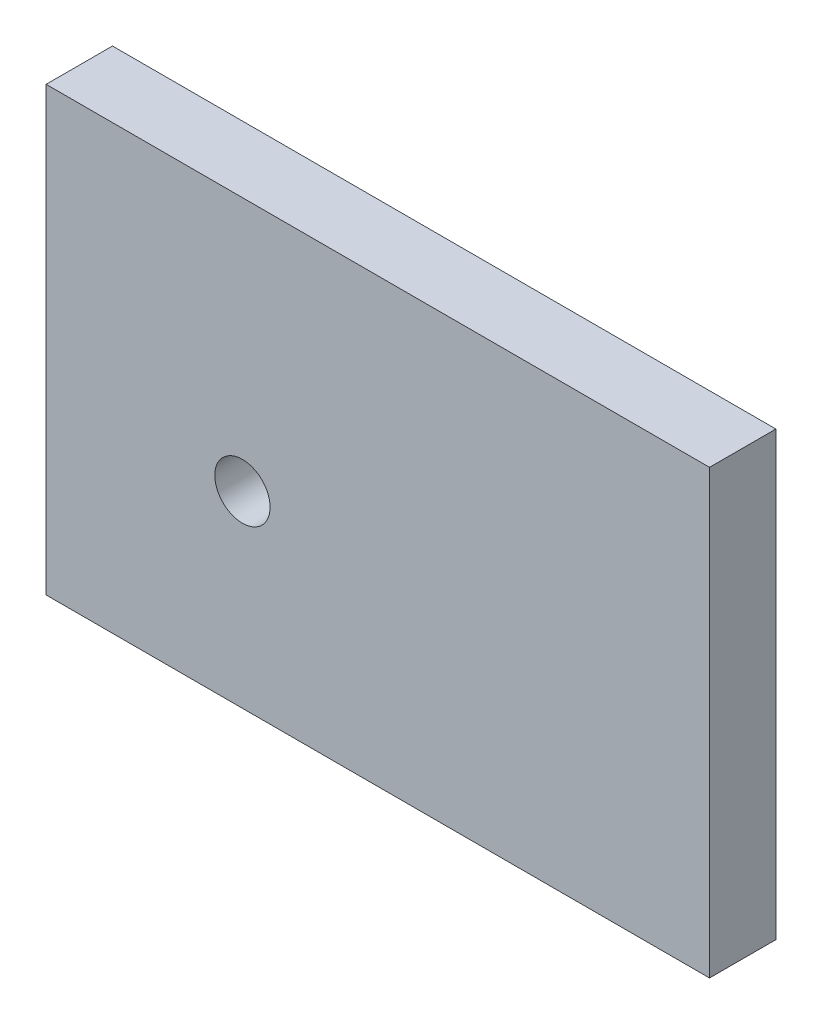
ISO-10303-21;
HEADER;
FILE_DESCRIPTION(('STEP AP214'),'2;1');
FILE_NAME('part.step','',(''),(''),'','','');
FILE_SCHEMA(('AUTOMOTIVE_DESIGN { 1 0 10303 214 1 1 1 1 }'));
ENDSEC;
DATA;
#1=APPLICATION_CONTEXT('core data for automotive mechanical design processes');
#2=APPLICATION_PROTOCOL_DEFINITION('international standard','automotive_design',2000,#1);
#3=PRODUCT_CONTEXT('',#1,'mechanical');
#4=PRODUCT('Part','Part','',(#3));
#5=PRODUCT_RELATED_PRODUCT_CATEGORY('part','',(#4));
#6=PRODUCT_DEFINITION_FORMATION('','',#4);
#7=PRODUCT_DEFINITION_CONTEXT('part definition',#1,'design');
#8=PRODUCT_DEFINITION('design','',#6,#7);
#9=PRODUCT_DEFINITION_SHAPE('','',#8);
#10=(LENGTH_UNIT() NAMED_UNIT(*) SI_UNIT(.MILLI.,.METRE.));
#11=(NAMED_UNIT(*) PLANE_ANGLE_UNIT() SI_UNIT($,.RADIAN.));
#12=(NAMED_UNIT(*) SI_UNIT($,.STERADIAN.) SOLID_ANGLE_UNIT());
#13=UNCERTAINTY_MEASURE_WITH_UNIT(LENGTH_MEASURE(1.E-05),#10,'distance_accuracy_value','');
#14=(GEOMETRIC_REPRESENTATION_CONTEXT(3) GLOBAL_UNCERTAINTY_ASSIGNED_CONTEXT((#13)) GLOBAL_UNIT_ASSIGNED_CONTEXT((#10,
#11,#12)) REPRESENTATION_CONTEXT('',''));
#15=CARTESIAN_POINT('',(0.,0.,0.));
#16=DIRECTION('',(0.,0.,1.));
#17=DIRECTION('',(1.,0.,0.));
#18=AXIS2_PLACEMENT_3D('',#15,#16,#17);
#19=CARTESIAN_POINT('',(0.,0.,6.));
#20=DIRECTION('',(-1.,0.,0.));
#21=DIRECTION('',(0.,-1.,0.));
#22=AXIS2_PLACEMENT_3D('',#19,#20,#21);
#23=PLANE('',#22);
#24=DIRECTION('',(0.,1.,0.));
#25=VECTOR('',#24,1.);
#26=CARTESIAN_POINT('',(0.,0.,0.));
#27=LINE('',#26,#25);
#28=CARTESIAN_POINT('',(0.,0.,0.));
#29=VERTEX_POINT('',#28);
#30=CARTESIAN_POINT('',(0.,40.,0.));
#31=VERTEX_POINT('',#30);
#32=EDGE_CURVE('E96',#29,#31,#27,.T.);
#33=ORIENTED_EDGE('',*,*,#32,.T.);
#34=DIRECTION('',(0.,0.,-1.));
#35=VECTOR('',#34,1.);
#36=CARTESIAN_POINT('',(0.,40.,6.));
#37=LINE('',#36,#35);
#38=CARTESIAN_POINT('',(0.,40.,6.));
#39=VERTEX_POINT('',#38);
#40=EDGE_CURVE('E11',#39,#31,#37,.T.);
#41=ORIENTED_EDGE('',*,*,#40,.F.);
#42=DIRECTION('',(0.,1.,0.));
#43=VECTOR('',#42,1.);
#44=CARTESIAN_POINT('',(0.,0.,6.));
#45=LINE('',#44,#43);
#46=CARTESIAN_POINT('',(0.,0.,6.));
#47=VERTEX_POINT('',#46);
#48=EDGE_CURVE('E84',#47,#39,#45,.T.);
#49=ORIENTED_EDGE('',*,*,#48,.F.);
#50=DIRECTION('',(0.,0.,-1.));
#51=VECTOR('',#50,1.);
#52=CARTESIAN_POINT('',(0.,0.,6.));
#53=LINE('',#52,#51);
#54=EDGE_CURVE('E92',#47,#29,#53,.T.);
#55=ORIENTED_EDGE('',*,*,#54,.T.);
#56=EDGE_LOOP('',(#33,#41,#49,#55));
#57=FACE_BOUND('',#56,.T.);
#58=ADVANCED_FACE('F33',(#57),#23,.F.);
#59=CARTESIAN_POINT('',(0.,40.,6.));
#60=DIRECTION('',(0.,-1.,0.));
#61=DIRECTION('',(1.,0.,0.));
#62=AXIS2_PLACEMENT_3D('',#59,#60,#61);
#63=PLANE('',#62);
#64=DIRECTION('',(-1.,0.,0.));
#65=VECTOR('',#64,1.);
#66=CARTESIAN_POINT('',(0.,40.,0.));
#67=LINE('',#66,#65);
#68=CARTESIAN_POINT('',(-60.,40.,0.));
#69=VERTEX_POINT('',#68);
#70=EDGE_CURVE('E88',#31,#69,#67,.T.);
#71=ORIENTED_EDGE('',*,*,#70,.T.);
#72=DIRECTION('',(0.,0.,-1.));
#73=VECTOR('',#72,1.);
#74=CARTESIAN_POINT('',(-60.,40.,6.));
#75=LINE('',#74,#73);
#76=CARTESIAN_POINT('',(-60.,40.,6.));
#77=VERTEX_POINT('',#76);
#78=EDGE_CURVE('E41',#77,#69,#75,.T.);
#79=ORIENTED_EDGE('',*,*,#78,.F.);
#80=DIRECTION('',(-1.,0.,0.));
#81=VECTOR('',#80,1.);
#82=CARTESIAN_POINT('',(0.,40.,6.));
#83=LINE('',#82,#81);
#84=EDGE_CURVE('E79',#39,#77,#83,.T.);
#85=ORIENTED_EDGE('',*,*,#84,.F.);
#86=ORIENTED_EDGE('',*,*,#40,.T.);
#87=EDGE_LOOP('',(#71,#79,#85,#86));
#88=FACE_BOUND('',#87,.T.);
#89=ADVANCED_FACE('F87',(#88),#63,.F.);
#90=CARTESIAN_POINT('',(-60.,0.,6.));
#91=DIRECTION('',(1.,0.,0.));
#92=DIRECTION('',(0.,0.,-1.));
#93=AXIS2_PLACEMENT_3D('',#90,#91,#92);
#94=PLANE('',#93);
#95=DIRECTION('',(0.,-1.,0.));
#96=VECTOR('',#95,1.);
#97=CARTESIAN_POINT('',(-60.,0.,0.));
#98=LINE('',#97,#96);
#99=CARTESIAN_POINT('',(-60.,0.,0.));
#100=VERTEX_POINT('',#99);
#101=EDGE_CURVE('E66',#69,#100,#98,.T.);
#102=ORIENTED_EDGE('',*,*,#101,.T.);
#103=DIRECTION('',(0.,0.,-1.));
#104=VECTOR('',#103,1.);
#105=CARTESIAN_POINT('',(-60.,0.,6.));
#106=LINE('',#105,#104);
#107=CARTESIAN_POINT('',(-60.,0.,6.));
#108=VERTEX_POINT('',#107);
#109=EDGE_CURVE('E89',#108,#100,#106,.T.);
#110=ORIENTED_EDGE('',*,*,#109,.F.);
#111=DIRECTION('',(0.,-1.,0.));
#112=VECTOR('',#111,1.);
#113=CARTESIAN_POINT('',(-60.,0.,6.));
#114=LINE('',#113,#112);
#115=EDGE_CURVE('E82',#77,#108,#114,.T.);
#116=ORIENTED_EDGE('',*,*,#115,.F.);
#117=ORIENTED_EDGE('',*,*,#78,.T.);
#118=EDGE_LOOP('',(#102,#110,#116,#117));
#119=FACE_BOUND('',#118,.T.);
#120=ADVANCED_FACE('F90',(#119),#94,.F.);
#121=CARTESIAN_POINT('',(0.,0.,6.));
#122=DIRECTION('',(0.,1.,0.));
#123=DIRECTION('',(0.,0.,1.));
#124=AXIS2_PLACEMENT_3D('',#121,#122,#123);
#125=PLANE('',#124);
#126=DIRECTION('',(1.,0.,0.));
#127=VECTOR('',#126,1.);
#128=CARTESIAN_POINT('',(0.,0.,0.));
#129=LINE('',#128,#127);
#130=EDGE_CURVE('E72',#100,#29,#129,.T.);
#131=ORIENTED_EDGE('',*,*,#130,.T.);
#132=ORIENTED_EDGE('',*,*,#54,.F.);
#133=DIRECTION('',(1.,0.,0.));
#134=VECTOR('',#133,1.);
#135=CARTESIAN_POINT('',(0.,0.,6.));
#136=LINE('',#135,#134);
#137=EDGE_CURVE('E49',#108,#47,#136,.T.);
#138=ORIENTED_EDGE('',*,*,#137,.F.);
#139=ORIENTED_EDGE('',*,*,#109,.T.);
#140=EDGE_LOOP('',(#131,#132,#138,#139));
#141=FACE_BOUND('',#140,.T.);
#142=ADVANCED_FACE('F104',(#141),#125,.F.);
#143=CARTESIAN_POINT('',(0.,0.,6.));
#144=DIRECTION('',(0.,0.,1.));
#145=DIRECTION('',(1.,0.,0.));
#146=AXIS2_PLACEMENT_3D('',#143,#144,#145);
#147=PLANE('',#146);
#148=CARTESIAN_POINT('',(-42.2455446706849,17.,6.));
#149=DIRECTION('',(0.,0.,1.));
#150=DIRECTION('',(1.,0.,0.));
#151=AXIS2_PLACEMENT_3D('',#148,#149,#150);
#152=CIRCLE('',#151,2.5);
#153=CARTESIAN_POINT('',(-39.7455446706849,17.,6.));
#154=VERTEX_POINT('',#153);
#155=EDGE_CURVE('E99',#154,#154,#152,.T.);
#156=ORIENTED_EDGE('',*,*,#155,.F.);
#157=EDGE_LOOP('',(#156));
#158=FACE_BOUND('',#157,.T.);
#159=ORIENTED_EDGE('',*,*,#48,.T.);
#160=ORIENTED_EDGE('',*,*,#84,.T.);
#161=ORIENTED_EDGE('',*,*,#115,.T.);
#162=ORIENTED_EDGE('',*,*,#137,.T.);
#163=EDGE_LOOP('',(#159,#160,#161,#162));
#164=FACE_BOUND('',#163,.T.);
#165=ADVANCED_FACE('F80',(#158,#164),#147,.T.);
#166=CARTESIAN_POINT('',(0.,0.,0.));
#167=DIRECTION('',(0.,0.,1.));
#168=DIRECTION('',(1.,0.,0.));
#169=AXIS2_PLACEMENT_3D('',#166,#167,#168);
#170=PLANE('',#169);
#171=CARTESIAN_POINT('',(-42.2455446706849,17.,0.));
#172=DIRECTION('',(0.,0.,-1.));
#173=DIRECTION('',(-1.,0.,0.));
#174=AXIS2_PLACEMENT_3D('',#171,#172,#173);
#175=CIRCLE('',#174,2.5);
#176=CARTESIAN_POINT('',(-44.7455446706849,17.,0.));
#177=VERTEX_POINT('',#176);
#178=EDGE_CURVE('E112',#177,#177,#175,.T.);
#179=ORIENTED_EDGE('',*,*,#178,.F.);
#180=EDGE_LOOP('',(#179));
#181=FACE_BOUND('',#180,.T.);
#182=ORIENTED_EDGE('',*,*,#32,.F.);
#183=ORIENTED_EDGE('',*,*,#130,.F.);
#184=ORIENTED_EDGE('',*,*,#101,.F.);
#185=ORIENTED_EDGE('',*,*,#70,.F.);
#186=EDGE_LOOP('',(#182,#183,#184,#185));
#187=FACE_BOUND('',#186,.T.);
#188=ADVANCED_FACE('F107',(#181,#187),#170,.F.);
#189=CARTESIAN_POINT('',(-42.2455446706849,17.,10.));
#190=DIRECTION('',(0.,0.,-1.));
#191=DIRECTION('',(-1.,0.,0.));
#192=AXIS2_PLACEMENT_3D('',#189,#190,#191);
#193=CYLINDRICAL_SURFACE('',#192,2.5);
#194=ORIENTED_EDGE('',*,*,#155,.T.);
#195=EDGE_LOOP('',(#194));
#196=FACE_BOUND('',#195,.T.);
#197=ORIENTED_EDGE('',*,*,#178,.T.);
#198=EDGE_LOOP('',(#197));
#199=FACE_BOUND('',#198,.T.);
#200=ADVANCED_FACE('F116',(#196,#199),#193,.F.);
#201=CLOSED_SHELL('',(#58,#89,#120,#142,#165,#188,#200));
#202=MANIFOLD_SOLID_BREP('B2',#201);
#203=ADVANCED_BREP_SHAPE_REPRESENTATION('',(#18,#202),#14);
#204=SHAPE_DEFINITION_REPRESENTATION(#9,#203);
ENDSEC;
END-ISO-10303-21;
